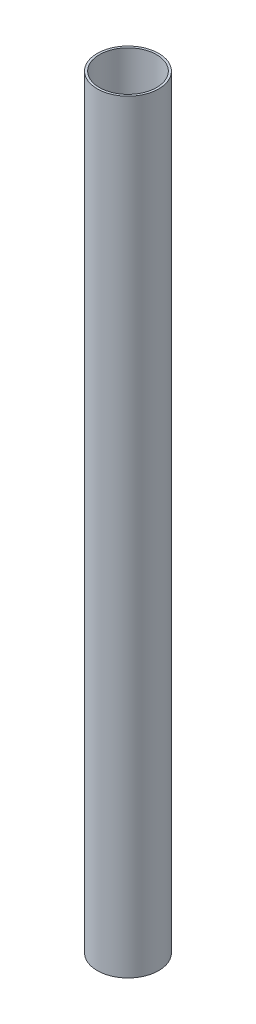
ISO-10303-21;
HEADER;
FILE_DESCRIPTION(('STEP AP214'),'2;1');
FILE_NAME('part.step','',(''),(''),'','','');
FILE_SCHEMA(('AUTOMOTIVE_DESIGN { 1 0 10303 214 1 1 1 1 }'));
ENDSEC;
DATA;
#1=APPLICATION_CONTEXT('core data for automotive mechanical design processes');
#2=APPLICATION_PROTOCOL_DEFINITION('international standard','automotive_design',2000,#1);
#3=PRODUCT_CONTEXT('',#1,'mechanical');
#4=PRODUCT('Part','Part','',(#3));
#5=PRODUCT_RELATED_PRODUCT_CATEGORY('part','',(#4));
#6=PRODUCT_DEFINITION_FORMATION('','',#4);
#7=PRODUCT_DEFINITION_CONTEXT('part definition',#1,'design');
#8=PRODUCT_DEFINITION('design','',#6,#7);
#9=PRODUCT_DEFINITION_SHAPE('','',#8);
#10=(LENGTH_UNIT() NAMED_UNIT(*) SI_UNIT(.MILLI.,.METRE.));
#11=(NAMED_UNIT(*) PLANE_ANGLE_UNIT() SI_UNIT($,.RADIAN.));
#12=(NAMED_UNIT(*) SI_UNIT($,.STERADIAN.) SOLID_ANGLE_UNIT());
#13=UNCERTAINTY_MEASURE_WITH_UNIT(LENGTH_MEASURE(1.E-05),#10,'distance_accuracy_value','');
#14=(GEOMETRIC_REPRESENTATION_CONTEXT(3) GLOBAL_UNCERTAINTY_ASSIGNED_CONTEXT((#13)) GLOBAL_UNIT_ASSIGNED_CONTEXT((#10,
#11,#12)) REPRESENTATION_CONTEXT('',''));
#15=CARTESIAN_POINT('',(0.,0.,0.));
#16=DIRECTION('',(0.,0.,1.));
#17=DIRECTION('',(1.,0.,0.));
#18=AXIS2_PLACEMENT_3D('',#15,#16,#17);
#19=CARTESIAN_POINT('',(0.,473.202,0.));
#20=DIRECTION('',(0.,1.,0.));
#21=DIRECTION('',(0.,0.,1.));
#22=AXIS2_PLACEMENT_3D('',#19,#20,#21);
#23=PLANE('',#22);
#24=CARTESIAN_POINT('',(0.,473.202,0.));
#25=DIRECTION('',(0.,1.,0.));
#26=DIRECTION('',(0.,0.,1.));
#27=AXIS2_PLACEMENT_3D('',#24,#25,#26);
#28=CIRCLE('',#27,19.05);
#29=CARTESIAN_POINT('',(0.,473.202,19.05));
#30=VERTEX_POINT('',#29);
#31=EDGE_CURVE('E11',#30,#30,#28,.T.);
#32=ORIENTED_EDGE('',*,*,#31,.T.);
#33=EDGE_LOOP('',(#32));
#34=FACE_BOUND('',#33,.T.);
#35=CARTESIAN_POINT('',(0.,473.202,0.));
#36=DIRECTION('',(0.,1.,0.));
#37=DIRECTION('',(1.,0.,0.));
#38=AXIS2_PLACEMENT_3D('',#35,#36,#37);
#39=CIRCLE('',#38,17.69872);
#40=CARTESIAN_POINT('',(17.69872,473.202,0.));
#41=VERTEX_POINT('',#40);
#42=EDGE_CURVE('E52',#41,#41,#39,.T.);
#43=ORIENTED_EDGE('',*,*,#42,.F.);
#44=EDGE_LOOP('',(#43));
#45=FACE_BOUND('',#44,.T.);
#46=ADVANCED_FACE('F41',(#34,#45),#23,.T.);
#47=CARTESIAN_POINT('',(0.,0.,0.));
#48=DIRECTION('',(0.,1.,0.));
#49=DIRECTION('',(0.,0.,1.));
#50=AXIS2_PLACEMENT_3D('',#47,#48,#49);
#51=PLANE('',#50);
#52=CARTESIAN_POINT('',(0.,0.,0.));
#53=DIRECTION('',(0.,1.,0.));
#54=DIRECTION('',(0.,0.,1.));
#55=AXIS2_PLACEMENT_3D('',#52,#53,#54);
#56=CIRCLE('',#55,19.05);
#57=CARTESIAN_POINT('',(0.,0.,19.05));
#58=VERTEX_POINT('',#57);
#59=EDGE_CURVE('E45',#58,#58,#56,.T.);
#60=ORIENTED_EDGE('',*,*,#59,.F.);
#61=EDGE_LOOP('',(#60));
#62=FACE_BOUND('',#61,.T.);
#63=CARTESIAN_POINT('',(0.,0.,0.));
#64=DIRECTION('',(0.,1.,0.));
#65=DIRECTION('',(1.,0.,0.));
#66=AXIS2_PLACEMENT_3D('',#63,#64,#65);
#67=CIRCLE('',#66,17.69872);
#68=CARTESIAN_POINT('',(17.69872,0.,0.));
#69=VERTEX_POINT('',#68);
#70=EDGE_CURVE('E54',#69,#69,#67,.T.);
#71=ORIENTED_EDGE('',*,*,#70,.T.);
#72=EDGE_LOOP('',(#71));
#73=FACE_BOUND('',#72,.T.);
#74=ADVANCED_FACE('F64',(#62,#73),#51,.F.);
#75=CARTESIAN_POINT('',(0.,473.202,0.));
#76=DIRECTION('',(0.,-1.,0.));
#77=DIRECTION('',(0.,0.,-1.));
#78=AXIS2_PLACEMENT_3D('',#75,#76,#77);
#79=CYLINDRICAL_SURFACE('',#78,19.05);
#80=ORIENTED_EDGE('',*,*,#31,.F.);
#81=EDGE_LOOP('',(#80));
#82=FACE_BOUND('',#81,.T.);
#83=ORIENTED_EDGE('',*,*,#59,.T.);
#84=EDGE_LOOP('',(#83));
#85=FACE_BOUND('',#84,.T.);
#86=ADVANCED_FACE('F43',(#82,#85),#79,.T.);
#87=CARTESIAN_POINT('',(0.,473.202,0.));
#88=DIRECTION('',(0.,-1.,0.));
#89=DIRECTION('',(0.,0.,-1.));
#90=AXIS2_PLACEMENT_3D('',#87,#88,#89);
#91=CYLINDRICAL_SURFACE('',#90,17.69872);
#92=ORIENTED_EDGE('',*,*,#42,.T.);
#93=EDGE_LOOP('',(#92));
#94=FACE_BOUND('',#93,.T.);
#95=ORIENTED_EDGE('',*,*,#70,.F.);
#96=EDGE_LOOP('',(#95));
#97=FACE_BOUND('',#96,.T.);
#98=ADVANCED_FACE('F60',(#94,#97),#91,.F.);
#99=CLOSED_SHELL('',(#46,#74,#86,#98));
#100=MANIFOLD_SOLID_BREP('B2',#99);
#101=ADVANCED_BREP_SHAPE_REPRESENTATION('',(#18,#100),#14);
#102=SHAPE_DEFINITION_REPRESENTATION(#9,#101);
ENDSEC;
END-ISO-10303-21;
